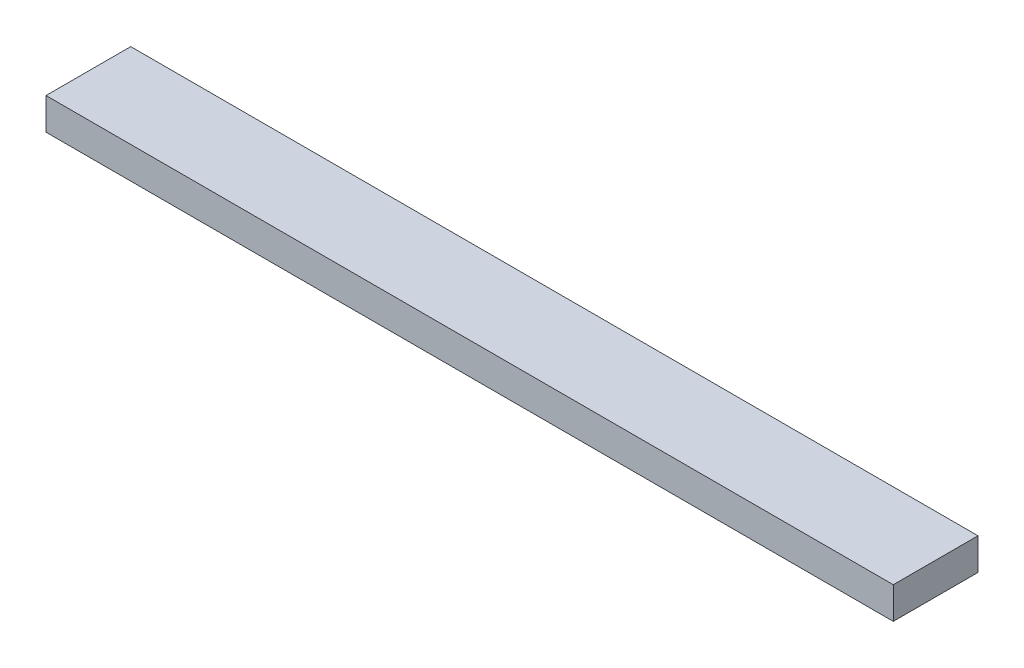
ISO-10303-21;
HEADER;
FILE_DESCRIPTION(('STEP AP214'),'2;1');
FILE_NAME('part.step','',(''),(''),'','','');
FILE_SCHEMA(('AUTOMOTIVE_DESIGN { 1 0 10303 214 1 1 1 1 }'));
ENDSEC;
DATA;
#1=APPLICATION_CONTEXT('core data for automotive mechanical design processes');
#2=APPLICATION_PROTOCOL_DEFINITION('international standard','automotive_design',2000,#1);
#3=PRODUCT_CONTEXT('',#1,'mechanical');
#4=PRODUCT('Part','Part','',(#3));
#5=PRODUCT_RELATED_PRODUCT_CATEGORY('part','',(#4));
#6=PRODUCT_DEFINITION_FORMATION('','',#4);
#7=PRODUCT_DEFINITION_CONTEXT('part definition',#1,'design');
#8=PRODUCT_DEFINITION('design','',#6,#7);
#9=PRODUCT_DEFINITION_SHAPE('','',#8);
#10=(LENGTH_UNIT() NAMED_UNIT(*) SI_UNIT(.MILLI.,.METRE.));
#11=(NAMED_UNIT(*) PLANE_ANGLE_UNIT() SI_UNIT($,.RADIAN.));
#12=(NAMED_UNIT(*) SI_UNIT($,.STERADIAN.) SOLID_ANGLE_UNIT());
#13=UNCERTAINTY_MEASURE_WITH_UNIT(LENGTH_MEASURE(1.E-05),#10,'distance_accuracy_value','');
#14=(GEOMETRIC_REPRESENTATION_CONTEXT(3) GLOBAL_UNCERTAINTY_ASSIGNED_CONTEXT((#13)) GLOBAL_UNIT_ASSIGNED_CONTEXT((#10,
#11,#12)) REPRESENTATION_CONTEXT('',''));
#15=CARTESIAN_POINT('',(0.,0.,0.));
#16=DIRECTION('',(0.,0.,1.));
#17=DIRECTION('',(1.,0.,0.));
#18=AXIS2_PLACEMENT_3D('',#15,#16,#17);
#19=CARTESIAN_POINT('',(254.,19.05,25.4));
#20=DIRECTION('',(-1.,0.,0.));
#21=DIRECTION('',(0.,0.,1.));
#22=AXIS2_PLACEMENT_3D('',#19,#20,#21);
#23=PLANE('',#22);
#24=DIRECTION('',(0.,0.,-1.));
#25=VECTOR('',#24,1.);
#26=CARTESIAN_POINT('',(254.,0.,25.4));
#27=LINE('',#26,#25);
#28=CARTESIAN_POINT('',(254.,0.,25.4));
#29=VERTEX_POINT('',#28);
#30=CARTESIAN_POINT('',(254.,0.,-25.4));
#31=VERTEX_POINT('',#30);
#32=EDGE_CURVE('E96',#29,#31,#27,.T.);
#33=ORIENTED_EDGE('',*,*,#32,.T.);
#34=DIRECTION('',(0.,-1.,0.));
#35=VECTOR('',#34,1.);
#36=CARTESIAN_POINT('',(254.,19.05,-25.4));
#37=LINE('',#36,#35);
#38=CARTESIAN_POINT('',(254.,19.05,-25.4));
#39=VERTEX_POINT('',#38);
#40=EDGE_CURVE('E11',#39,#31,#37,.T.);
#41=ORIENTED_EDGE('',*,*,#40,.F.);
#42=DIRECTION('',(0.,0.,-1.));
#43=VECTOR('',#42,1.);
#44=CARTESIAN_POINT('',(254.,19.05,25.4));
#45=LINE('',#44,#43);
#46=CARTESIAN_POINT('',(254.,19.05,25.4));
#47=VERTEX_POINT('',#46);
#48=EDGE_CURVE('E84',#47,#39,#45,.T.);
#49=ORIENTED_EDGE('',*,*,#48,.F.);
#50=DIRECTION('',(0.,-1.,0.));
#51=VECTOR('',#50,1.);
#52=CARTESIAN_POINT('',(254.,19.05,25.4));
#53=LINE('',#52,#51);
#54=EDGE_CURVE('E92',#47,#29,#53,.T.);
#55=ORIENTED_EDGE('',*,*,#54,.T.);
#56=EDGE_LOOP('',(#33,#41,#49,#55));
#57=FACE_BOUND('',#56,.T.);
#58=ADVANCED_FACE('F33',(#57),#23,.F.);
#59=CARTESIAN_POINT('',(-254.,19.05,-25.4));
#60=DIRECTION('',(0.,0.,1.));
#61=DIRECTION('',(1.,0.,0.));
#62=AXIS2_PLACEMENT_3D('',#59,#60,#61);
#63=PLANE('',#62);
#64=DIRECTION('',(-1.,0.,0.));
#65=VECTOR('',#64,1.);
#66=CARTESIAN_POINT('',(-254.,0.,-25.4));
#67=LINE('',#66,#65);
#68=CARTESIAN_POINT('',(-254.,0.,-25.4));
#69=VERTEX_POINT('',#68);
#70=EDGE_CURVE('E88',#31,#69,#67,.T.);
#71=ORIENTED_EDGE('',*,*,#70,.T.);
#72=DIRECTION('',(0.,-1.,0.));
#73=VECTOR('',#72,1.);
#74=CARTESIAN_POINT('',(-254.,19.05,-25.4));
#75=LINE('',#74,#73);
#76=CARTESIAN_POINT('',(-254.,19.05,-25.4));
#77=VERTEX_POINT('',#76);
#78=EDGE_CURVE('E41',#77,#69,#75,.T.);
#79=ORIENTED_EDGE('',*,*,#78,.F.);
#80=DIRECTION('',(-1.,0.,0.));
#81=VECTOR('',#80,1.);
#82=CARTESIAN_POINT('',(-254.,19.05,-25.4));
#83=LINE('',#82,#81);
#84=EDGE_CURVE('E79',#39,#77,#83,.T.);
#85=ORIENTED_EDGE('',*,*,#84,.F.);
#86=ORIENTED_EDGE('',*,*,#40,.T.);
#87=EDGE_LOOP('',(#71,#79,#85,#86));
#88=FACE_BOUND('',#87,.T.);
#89=ADVANCED_FACE('F87',(#88),#63,.F.);
#90=CARTESIAN_POINT('',(-254.,19.05,25.4));
#91=DIRECTION('',(1.,0.,0.));
#92=DIRECTION('',(0.,0.,-1.));
#93=AXIS2_PLACEMENT_3D('',#90,#91,#92);
#94=PLANE('',#93);
#95=DIRECTION('',(0.,0.,1.));
#96=VECTOR('',#95,1.);
#97=CARTESIAN_POINT('',(-254.,0.,25.4));
#98=LINE('',#97,#96);
#99=CARTESIAN_POINT('',(-254.,0.,25.4));
#100=VERTEX_POINT('',#99);
#101=EDGE_CURVE('E66',#69,#100,#98,.T.);
#102=ORIENTED_EDGE('',*,*,#101,.T.);
#103=DIRECTION('',(0.,-1.,0.));
#104=VECTOR('',#103,1.);
#105=CARTESIAN_POINT('',(-254.,19.05,25.4));
#106=LINE('',#105,#104);
#107=CARTESIAN_POINT('',(-254.,19.05,25.4));
#108=VERTEX_POINT('',#107);
#109=EDGE_CURVE('E89',#108,#100,#106,.T.);
#110=ORIENTED_EDGE('',*,*,#109,.F.);
#111=DIRECTION('',(0.,0.,1.));
#112=VECTOR('',#111,1.);
#113=CARTESIAN_POINT('',(-254.,19.05,25.4));
#114=LINE('',#113,#112);
#115=EDGE_CURVE('E82',#77,#108,#114,.T.);
#116=ORIENTED_EDGE('',*,*,#115,.F.);
#117=ORIENTED_EDGE('',*,*,#78,.T.);
#118=EDGE_LOOP('',(#102,#110,#116,#117));
#119=FACE_BOUND('',#118,.T.);
#120=ADVANCED_FACE('F90',(#119),#94,.F.);
#121=CARTESIAN_POINT('',(-254.,19.05,25.4));
#122=DIRECTION('',(0.,0.,-1.));
#123=DIRECTION('',(-1.,0.,0.));
#124=AXIS2_PLACEMENT_3D('',#121,#122,#123);
#125=PLANE('',#124);
#126=DIRECTION('',(1.,0.,0.));
#127=VECTOR('',#126,1.);
#128=CARTESIAN_POINT('',(-254.,0.,25.4));
#129=LINE('',#128,#127);
#130=EDGE_CURVE('E72',#100,#29,#129,.T.);
#131=ORIENTED_EDGE('',*,*,#130,.T.);
#132=ORIENTED_EDGE('',*,*,#54,.F.);
#133=DIRECTION('',(1.,0.,0.));
#134=VECTOR('',#133,1.);
#135=CARTESIAN_POINT('',(-254.,19.05,25.4));
#136=LINE('',#135,#134);
#137=EDGE_CURVE('E49',#108,#47,#136,.T.);
#138=ORIENTED_EDGE('',*,*,#137,.F.);
#139=ORIENTED_EDGE('',*,*,#109,.T.);
#140=EDGE_LOOP('',(#131,#132,#138,#139));
#141=FACE_BOUND('',#140,.T.);
#142=ADVANCED_FACE('F103',(#141),#125,.F.);
#143=CARTESIAN_POINT('',(0.,19.05,0.));
#144=DIRECTION('',(0.,-1.,0.));
#145=DIRECTION('',(0.,0.,-1.));
#146=AXIS2_PLACEMENT_3D('',#143,#144,#145);
#147=PLANE('',#146);
#148=ORIENTED_EDGE('',*,*,#48,.T.);
#149=ORIENTED_EDGE('',*,*,#84,.T.);
#150=ORIENTED_EDGE('',*,*,#115,.T.);
#151=ORIENTED_EDGE('',*,*,#137,.T.);
#152=EDGE_LOOP('',(#148,#149,#150,#151));
#153=FACE_BOUND('',#152,.T.);
#154=ADVANCED_FACE('F80',(#153),#147,.F.);
#155=CARTESIAN_POINT('',(0.,0.,0.));
#156=DIRECTION('',(0.,-1.,0.));
#157=DIRECTION('',(0.,0.,-1.));
#158=AXIS2_PLACEMENT_3D('',#155,#156,#157);
#159=PLANE('',#158);
#160=ORIENTED_EDGE('',*,*,#32,.F.);
#161=ORIENTED_EDGE('',*,*,#130,.F.);
#162=ORIENTED_EDGE('',*,*,#101,.F.);
#163=ORIENTED_EDGE('',*,*,#70,.F.);
#164=EDGE_LOOP('',(#160,#161,#162,#163));
#165=FACE_BOUND('',#164,.T.);
#166=ADVANCED_FACE('F106',(#165),#159,.T.);
#167=CLOSED_SHELL('',(#58,#89,#120,#142,#154,#166));
#168=MANIFOLD_SOLID_BREP('B2',#167);
#169=ADVANCED_BREP_SHAPE_REPRESENTATION('',(#18,#168),#14);
#170=SHAPE_DEFINITION_REPRESENTATION(#9,#169);
ENDSEC;
END-ISO-10303-21;
